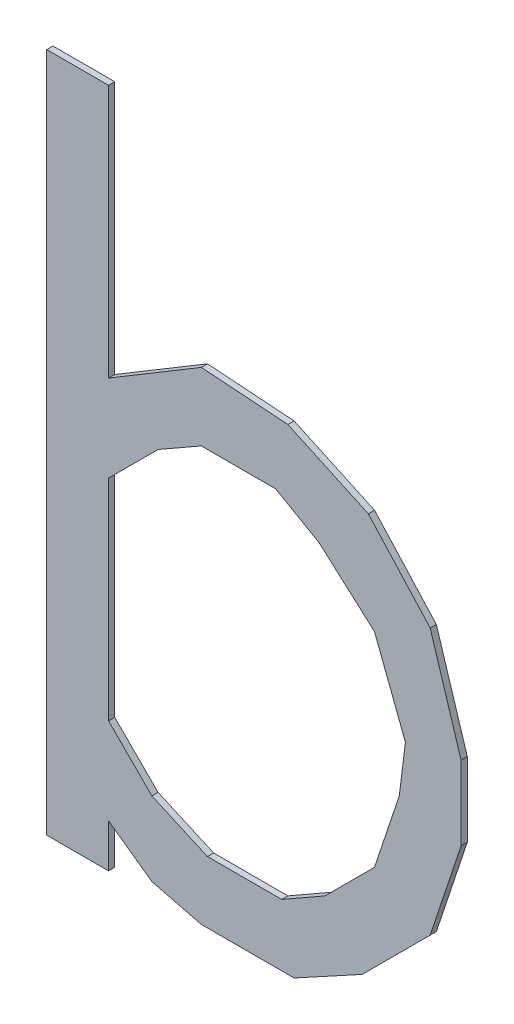
ISO-10303-21;
HEADER;
FILE_DESCRIPTION(('STEP AP214'),'2;1');
FILE_NAME('part.step','',(''),(''),'','','');
FILE_SCHEMA(('AUTOMOTIVE_DESIGN { 1 0 10303 214 1 1 1 1 }'));
ENDSEC;
DATA;
#1=APPLICATION_CONTEXT('core data for automotive mechanical design processes');
#2=APPLICATION_PROTOCOL_DEFINITION('international standard','automotive_design',2000,#1);
#3=PRODUCT_CONTEXT('',#1,'mechanical');
#4=PRODUCT('Part','Part','',(#3));
#5=PRODUCT_RELATED_PRODUCT_CATEGORY('part','',(#4));
#6=PRODUCT_DEFINITION_FORMATION('','',#4);
#7=PRODUCT_DEFINITION_CONTEXT('part definition',#1,'design');
#8=PRODUCT_DEFINITION('design','',#6,#7);
#9=PRODUCT_DEFINITION_SHAPE('','',#8);
#10=(LENGTH_UNIT() NAMED_UNIT(*) SI_UNIT(.MILLI.,.METRE.));
#11=(NAMED_UNIT(*) PLANE_ANGLE_UNIT() SI_UNIT($,.RADIAN.));
#12=(NAMED_UNIT(*) SI_UNIT($,.STERADIAN.) SOLID_ANGLE_UNIT());
#13=UNCERTAINTY_MEASURE_WITH_UNIT(LENGTH_MEASURE(1.E-05),#10,'distance_accuracy_value','');
#14=(GEOMETRIC_REPRESENTATION_CONTEXT(3) GLOBAL_UNCERTAINTY_ASSIGNED_CONTEXT((#13)) GLOBAL_UNIT_ASSIGNED_CONTEXT((#10,
#11,#12)) REPRESENTATION_CONTEXT('',''));
#15=CARTESIAN_POINT('',(0.,0.,0.));
#16=DIRECTION('',(0.,0.,1.));
#17=DIRECTION('',(1.,0.,0.));
#18=AXIS2_PLACEMENT_3D('',#15,#16,#17);
#19=CARTESIAN_POINT('',(-0.2350008,0.14000226,0.));
#20=DIRECTION('',(1.,0.,0.));
#21=DIRECTION('',(0.,0.,-1.));
#22=AXIS2_PLACEMENT_3D('',#19,#20,#21);
#23=PLANE('',#22);
#24=DIRECTION('',(0.,0.,1.));
#25=VECTOR('',#24,1.);
#26=CARTESIAN_POINT('',(-0.2350008,2.539999996998E-06,0.));
#27=LINE('',#26,#25);
#28=CARTESIAN_POINT('',(-0.2350008,2.53999999694202E-06,0.));
#29=VERTEX_POINT('',#28);
#30=CARTESIAN_POINT('',(-0.2350008,2.53999999696469E-06,0.01));
#31=VERTEX_POINT('',#30);
#32=EDGE_CURVE('E257',#29,#31,#27,.T.);
#33=ORIENTED_EDGE('',*,*,#32,.T.);
#34=DIRECTION('',(0.,1.,0.));
#35=VECTOR('',#34,1.);
#36=CARTESIAN_POINT('',(-0.2350008,-0.33999678,0.01));
#37=LINE('',#36,#35);
#38=CARTESIAN_POINT('',(-0.2350008,0.14000225999993,0.01));
#39=VERTEX_POINT('',#38);
#40=EDGE_CURVE('E234',#31,#39,#37,.T.);
#41=ORIENTED_EDGE('',*,*,#40,.T.);
#42=DIRECTION('',(0.,0.,1.));
#43=VECTOR('',#42,1.);
#44=CARTESIAN_POINT('',(-0.235000799999938,0.140002259999897,0.));
#45=LINE('',#44,#43);
#46=CARTESIAN_POINT('',(-0.235000799999985,0.140002259999949,0.));
#47=VERTEX_POINT('',#46);
#48=EDGE_CURVE('E239',#39,#47,#45,.F.);
#49=ORIENTED_EDGE('',*,*,#48,.T.);
#50=DIRECTION('',(0.,1.,0.));
#51=VECTOR('',#50,1.);
#52=CARTESIAN_POINT('',(-0.2350008,-0.33999678,0.));
#53=LINE('',#52,#51);
#54=EDGE_CURVE('E240',#47,#29,#53,.F.);
#55=ORIENTED_EDGE('',*,*,#54,.T.);
#56=EDGE_LOOP('',(#33,#41,#49,#55));
#57=FACE_BOUND('',#56,.T.);
#58=ADVANCED_FACE('F17',(#57),#23,.F.);
#59=CARTESIAN_POINT('',(-0.3350006,0.55000144,0.));
#60=DIRECTION('',(0.,0.,-1.));
#61=DIRECTION('',(-1.,0.,0.));
#62=AXIS2_PLACEMENT_3D('',#59,#60,#61);
#63=PLANE('',#62);
#64=DIRECTION('',(0.,1.,0.));
#65=VECTOR('',#64,1.);
#66=CARTESIAN_POINT('',(-0.3350006,0.55000144,0.));
#67=LINE('',#66,#65);
#68=CARTESIAN_POINT('',(-0.3350006,-0.5499989,0.));
#69=VERTEX_POINT('',#68);
#70=CARTESIAN_POINT('',(-0.3350006,0.55000144,0.));
#71=VERTEX_POINT('',#70);
#72=EDGE_CURVE('E381',#69,#71,#67,.T.);
#73=ORIENTED_EDGE('',*,*,#72,.T.);
#74=DIRECTION('',(-1.,0.,0.));
#75=VECTOR('',#74,1.);
#76=CARTESIAN_POINT('',(-0.3350006,0.55000144,0.));
#77=LINE('',#76,#75);
#78=CARTESIAN_POINT('',(-0.2350008,0.55000144,0.));
#79=VERTEX_POINT('',#78);
#80=EDGE_CURVE('E378',#71,#79,#77,.F.);
#81=ORIENTED_EDGE('',*,*,#80,.T.);
#82=DIRECTION('',(0.,1.,0.));
#83=VECTOR('',#82,1.);
#84=CARTESIAN_POINT('',(-0.2350008,0.55000144,0.));
#85=LINE('',#84,#83);
#86=EDGE_CURVE('E246',#79,#47,#85,.F.);
#87=ORIENTED_EDGE('',*,*,#86,.T.);
#88=DIRECTION('',(0.857492925712544,0.514495755427526,0.));
#89=VECTOR('',#88,1.);
#90=CARTESIAN_POINT('',(-0.2350008,0.14000226,0.));
#91=LINE('',#90,#89);
#92=CARTESIAN_POINT('',(-0.0850010999999992,0.230002080000002,0.));
#93=VERTEX_POINT('',#92);
#94=EDGE_CURVE('E243',#47,#93,#91,.T.);
#95=ORIENTED_EDGE('',*,*,#94,.T.);
#96=DIRECTION('',(0.99745879169011,-0.0712457639449961,0.));
#97=VECTOR('',#96,1.);
#98=CARTESIAN_POINT('',(-0.0850011,0.23000208,0.));
#99=LINE('',#98,#97);
#100=CARTESIAN_POINT('',(0.0550011600000024,0.220002100000014,0.));
#101=VERTEX_POINT('',#100);
#102=EDGE_CURVE('E420',#93,#101,#99,.T.);
#103=ORIENTED_EDGE('',*,*,#102,.T.);
#104=DIRECTION('',(0.907959384500464,-0.41905817746172,0.));
#105=VECTOR('',#104,1.);
#106=CARTESIAN_POINT('',(0.05500115999999,0.2200021,0.));
#107=LINE('',#106,#105);
#108=CARTESIAN_POINT('',(0.185000900000009,0.160002220000004,0.));
#109=VERTEX_POINT('',#108);
#110=EDGE_CURVE('E418',#101,#109,#107,.T.);
#111=ORIENTED_EDGE('',*,*,#110,.T.);
#112=DIRECTION('',(0.672672793996279,-0.739940073395974,0.));
#113=VECTOR('',#112,1.);
#114=CARTESIAN_POINT('',(0.1850009,0.16000222,0.));
#115=LINE('',#114,#113);
#116=CARTESIAN_POINT('',(0.285000699999998,0.0500024399999901,0.));
#117=VERTEX_POINT('',#116);
#118=EDGE_CURVE('E415',#109,#117,#115,.T.);
#119=ORIENTED_EDGE('',*,*,#118,.T.);
#120=DIRECTION('',(0.298274993135964,-0.954479978035025,0.));
#121=VECTOR('',#120,1.);
#122=CARTESIAN_POINT('',(0.2850007,0.0500024399999901,0.));
#123=LINE('',#122,#121);
#124=CARTESIAN_POINT('',(0.3350006,-0.10999724,0.));
#125=VERTEX_POINT('',#124);
#126=EDGE_CURVE('E412',#117,#125,#123,.T.);
#127=ORIENTED_EDGE('',*,*,#126,.T.);
#128=DIRECTION('',(0.,1.,0.));
#129=VECTOR('',#128,1.);
#130=CARTESIAN_POINT('',(0.3350006,0.55000144,0.));
#131=LINE('',#130,#129);
#132=CARTESIAN_POINT('',(0.3350006,-0.229996999999999,0.));
#133=VERTEX_POINT('',#132);
#134=EDGE_CURVE('E409',#125,#133,#131,.F.);
#135=ORIENTED_EDGE('',*,*,#134,.T.);
#136=DIRECTION('',(-0.316227766016838,-0.948683298050514,0.));
#137=VECTOR('',#136,1.);
#138=CARTESIAN_POINT('',(0.3350006,-0.229997,0.));
#139=LINE('',#138,#137);
#140=CARTESIAN_POINT('',(0.285000699999993,-0.379996699999986,0.));
#141=VERTEX_POINT('',#140);
#142=EDGE_CURVE('E406',#133,#141,#139,.T.);
#143=ORIENTED_EDGE('',*,*,#142,.T.);
#144=DIRECTION('',(-0.707098617348147,-0.707114944930694,0.));
#145=VECTOR('',#144,1.);
#146=CARTESIAN_POINT('',(0.2850007,-0.3799967,0.));
#147=LINE('',#146,#145);
#148=CARTESIAN_POINT('',(0.175000919999995,-0.48999901999998,0.));
#149=VERTEX_POINT('',#148);
#150=EDGE_CURVE('E403',#141,#149,#147,.T.);
#151=ORIENTED_EDGE('',*,*,#150,.T.);
#152=DIRECTION('',(-0.877895572914404,-0.478852130680538,0.));
#153=VECTOR('',#152,1.);
#154=CARTESIAN_POINT('',(0.17500092,-0.48999902,0.));
#155=LINE('',#154,#153);
#156=CARTESIAN_POINT('',(0.06500113999999,-0.5499989,0.));
#157=VERTEX_POINT('',#156);
#158=EDGE_CURVE('E400',#149,#157,#155,.T.);
#159=ORIENTED_EDGE('',*,*,#158,.T.);
#160=DIRECTION('',(-1.,0.,0.));
#161=VECTOR('',#160,1.);
#162=CARTESIAN_POINT('',(-0.3350006,-0.5499989,0.));
#163=LINE('',#162,#161);
#164=CARTESIAN_POINT('',(-0.0850010999999976,-0.549998899999995,0.));
#165=VERTEX_POINT('',#164);
#166=EDGE_CURVE('E397',#157,#165,#163,.T.);
#167=ORIENTED_EDGE('',*,*,#166,.T.);
#168=DIRECTION('',(-0.970142500145333,0.24253562503633,0.));
#169=VECTOR('',#168,1.);
#170=CARTESIAN_POINT('',(-0.0850011,-0.5499989,0.));
#171=LINE('',#170,#169);
#172=CARTESIAN_POINT('',(-0.165000939999995,-0.529998939999996,0.));
#173=VERTEX_POINT('',#172);
#174=EDGE_CURVE('E394',#165,#173,#171,.T.);
#175=ORIENTED_EDGE('',*,*,#174,.T.);
#176=DIRECTION('',(-0.813733471206734,0.581238193719097,0.));
#177=VECTOR('',#176,1.);
#178=CARTESIAN_POINT('',(-0.16500094,-0.52999894,0.));
#179=LINE('',#178,#177);
#180=CARTESIAN_POINT('',(-0.2350008,-0.47999904,0.));
#181=VERTEX_POINT('',#180);
#182=EDGE_CURVE('E391',#173,#181,#179,.T.);
#183=ORIENTED_EDGE('',*,*,#182,.T.);
#184=DIRECTION('',(0.,1.,0.));
#185=VECTOR('',#184,1.);
#186=CARTESIAN_POINT('',(-0.2350008,0.55000144,0.));
#187=LINE('',#186,#185);
#188=CARTESIAN_POINT('',(-0.2350008,-0.5499989,0.));
#189=VERTEX_POINT('',#188);
#190=EDGE_CURVE('E388',#181,#189,#187,.F.);
#191=ORIENTED_EDGE('',*,*,#190,.T.);
#192=DIRECTION('',(-1.,0.,0.));
#193=VECTOR('',#192,1.);
#194=CARTESIAN_POINT('',(-0.3350006,-0.5499989,0.));
#195=LINE('',#194,#193);
#196=EDGE_CURVE('E385',#189,#69,#195,.T.);
#197=ORIENTED_EDGE('',*,*,#196,.T.);
#198=EDGE_LOOP('',(#73,#81,#87,#95,#103,#111,#119,#127,#135,#143,#151,#159,#167,#175,#183,#191,#197));
#199=FACE_BOUND('',#198,.T.);
#200=DIRECTION('',(-0.868243142124459,-0.496138938356834,0.));
#201=VECTOR('',#200,1.);
#202=CARTESIAN_POINT('',(-0.0850011,0.1200023,0.));
#203=LINE('',#202,#201);
#204=CARTESIAN_POINT('',(-0.0850010999999975,0.120002299999998,0.));
#205=VERTEX_POINT('',#204);
#206=CARTESIAN_POINT('',(-0.155000959999999,0.0800023799999998,0.));
#207=VERTEX_POINT('',#206);
#208=EDGE_CURVE('E255',#205,#207,#203,.T.);
#209=ORIENTED_EDGE('',*,*,#208,.T.);
#210=DIRECTION('',(-0.707106781186534,-0.707106781186561,0.));
#211=VECTOR('',#210,1.);
#212=CARTESIAN_POINT('',(-0.15500096,0.08000238,0.));
#213=LINE('',#212,#211);
#214=EDGE_CURVE('E235',#207,#29,#213,.T.);
#215=ORIENTED_EDGE('',*,*,#214,.T.);
#216=DIRECTION('',(0.,1.,0.));
#217=VECTOR('',#216,1.);
#218=CARTESIAN_POINT('',(-0.2350008,0.55000144,0.));
#219=LINE('',#218,#217);
#220=CARTESIAN_POINT('',(-0.2350008,-0.33999678,0.));
#221=VERTEX_POINT('',#220);
#222=EDGE_CURVE('E230',#29,#221,#219,.F.);
#223=ORIENTED_EDGE('',*,*,#222,.T.);
#224=DIRECTION('',(0.707106781186547,-0.707106781186548,0.));
#225=VECTOR('',#224,1.);
#226=CARTESIAN_POINT('',(-0.2350008,-0.33999678,0.));
#227=LINE('',#226,#225);
#228=CARTESIAN_POINT('',(-0.165000940000001,-0.409996640000009,0.));
#229=VERTEX_POINT('',#228);
#230=EDGE_CURVE('E20',#221,#229,#227,.T.);
#231=ORIENTED_EDGE('',*,*,#230,.T.);
#232=DIRECTION('',(0.913811548620257,-0.406138466053447,0.));
#233=VECTOR('',#232,1.);
#234=CARTESIAN_POINT('',(-0.16500094,-0.40999664,0.));
#235=LINE('',#234,#233);
#236=CARTESIAN_POINT('',(-0.07500112,-0.44999656,0.));
#237=VERTEX_POINT('',#236);
#238=EDGE_CURVE('E285',#229,#237,#235,.T.);
#239=ORIENTED_EDGE('',*,*,#238,.T.);
#240=DIRECTION('',(-1.,0.,0.));
#241=VECTOR('',#240,1.);
#242=CARTESIAN_POINT('',(-0.3350006,-0.44999656,0.));
#243=LINE('',#242,#241);
#244=CARTESIAN_POINT('',(0.0450011800000162,-0.449996560000005,0.));
#245=VERTEX_POINT('',#244);
#246=EDGE_CURVE('E283',#237,#245,#243,.F.);
#247=ORIENTED_EDGE('',*,*,#246,.T.);
#248=DIRECTION('',(0.868243142124429,0.496138938356887,0.));
#249=VECTOR('',#248,1.);
#250=CARTESIAN_POINT('',(0.04500118000001,-0.44999656,0.));
#251=LINE('',#250,#249);
#252=CARTESIAN_POINT('',(0.11500104,-0.40999664,0.));
#253=VERTEX_POINT('',#252);
#254=EDGE_CURVE('E280',#245,#253,#251,.T.);
#255=ORIENTED_EDGE('',*,*,#254,.T.);
#256=DIRECTION('',(0.707106781186547,0.707106781186548,0.));
#257=VECTOR('',#256,1.);
#258=CARTESIAN_POINT('',(0.11500104,-0.40999664,0.));
#259=LINE('',#258,#257);
#260=CARTESIAN_POINT('',(0.19500088,-0.3299968,0.));
#261=VERTEX_POINT('',#260);
#262=EDGE_CURVE('E277',#253,#261,#259,.T.);
#263=ORIENTED_EDGE('',*,*,#262,.T.);
#264=DIRECTION('',(0.316227766016838,0.948683298050514,0.));
#265=VECTOR('',#264,1.);
#266=CARTESIAN_POINT('',(0.19500088,-0.3299968,0.));
#267=LINE('',#266,#265);
#268=CARTESIAN_POINT('',(0.235000800000005,-0.20999704,0.));
#269=VERTEX_POINT('',#268);
#270=EDGE_CURVE('E274',#261,#269,#267,.T.);
#271=ORIENTED_EDGE('',*,*,#270,.T.);
#272=DIRECTION('',(0.124034734589208,0.992277876713668,0.));
#273=VECTOR('',#272,1.);
#274=CARTESIAN_POINT('',(0.2350008,-0.20999704,0.));
#275=LINE('',#274,#273);
#276=CARTESIAN_POINT('',(0.245000780000005,-0.129997199999996,0.));
#277=VERTEX_POINT('',#276);
#278=EDGE_CURVE('E271',#269,#277,#275,.T.);
#279=ORIENTED_EDGE('',*,*,#278,.T.);
#280=DIRECTION('',(-0.358979079308876,0.933345606203057,0.));
#281=VECTOR('',#280,1.);
#282=CARTESIAN_POINT('',(0.24500078,-0.1299972,0.));
#283=LINE('',#282,#281);
#284=CARTESIAN_POINT('',(0.195000880000003,2.54000000350266E-06,0.));
#285=VERTEX_POINT('',#284);
#286=EDGE_CURVE('E268',#277,#285,#283,.T.);
#287=ORIENTED_EDGE('',*,*,#286,.T.);
#288=DIRECTION('',(-0.747409318683647,0.664363838829934,0.));
#289=VECTOR('',#288,1.);
#290=CARTESIAN_POINT('',(0.19500088,2.5399999970064E-06,0.));
#291=LINE('',#290,#289);
#292=CARTESIAN_POINT('',(0.105001060000001,0.0800023800000038,0.));
#293=VERTEX_POINT('',#292);
#294=EDGE_CURVE('E265',#285,#293,#291,.T.);
#295=ORIENTED_EDGE('',*,*,#294,.T.);
#296=DIRECTION('',(-0.868243142124429,0.496138938356887,0.));
#297=VECTOR('',#296,1.);
#298=CARTESIAN_POINT('',(0.10500106,0.08000238,0.));
#299=LINE('',#298,#297);
#300=CARTESIAN_POINT('',(0.0350012000000099,0.1200023,0.));
#301=VERTEX_POINT('',#300);
#302=EDGE_CURVE('E262',#293,#301,#299,.T.);
#303=ORIENTED_EDGE('',*,*,#302,.T.);
#304=DIRECTION('',(-1.,0.,0.));
#305=VECTOR('',#304,1.);
#306=CARTESIAN_POINT('',(-0.3350006,0.1200023,0.));
#307=LINE('',#306,#305);
#308=EDGE_CURVE('E259',#301,#205,#307,.T.);
#309=ORIENTED_EDGE('',*,*,#308,.T.);
#310=EDGE_LOOP('',(#209,#215,#223,#231,#239,#247,#255,#263,#271,#279,#287,#295,#303,#309));
#311=FACE_BOUND('',#310,.T.);
#312=ADVANCED_FACE('F237',(#199,#311),#63,.T.);
#313=CARTESIAN_POINT('',(-0.16500094,-0.40999664,0.));
#314=DIRECTION('',(-0.707106781186548,-0.707106781186548,0.));
#315=DIRECTION('',(0.707106781186548,-0.707106781186548,0.));
#316=AXIS2_PLACEMENT_3D('',#313,#314,#315);
#317=PLANE('',#316);
#318=DIRECTION('',(0.,0.,1.));
#319=VECTOR('',#318,1.);
#320=CARTESIAN_POINT('',(-0.2350008,-0.33999678,0.));
#321=LINE('',#320,#319);
#322=CARTESIAN_POINT('',(-0.2350008,-0.33999678,0.01));
#323=VERTEX_POINT('',#322);
#324=EDGE_CURVE('E220',#221,#323,#321,.T.);
#325=ORIENTED_EDGE('',*,*,#324,.T.);
#326=DIRECTION('',(0.707106781186548,-0.707106781186548,0.));
#327=VECTOR('',#326,1.);
#328=CARTESIAN_POINT('',(-0.16500094,-0.40999664,0.01));
#329=LINE('',#328,#327);
#330=CARTESIAN_POINT('',(-0.165000939999977,-0.409996640000043,0.01));
#331=VERTEX_POINT('',#330);
#332=EDGE_CURVE('E375',#323,#331,#329,.T.);
#333=ORIENTED_EDGE('',*,*,#332,.T.);
#334=DIRECTION('',(0.,0.,1.));
#335=VECTOR('',#334,1.);
#336=CARTESIAN_POINT('',(-0.165000940000012,-0.409996640000027,0.));
#337=LINE('',#336,#335);
#338=EDGE_CURVE('E222',#331,#229,#337,.F.);
#339=ORIENTED_EDGE('',*,*,#338,.T.);
#340=ORIENTED_EDGE('',*,*,#230,.F.);
#341=EDGE_LOOP('',(#325,#333,#339,#340));
#342=FACE_BOUND('',#341,.T.);
#343=ADVANCED_FACE('F218',(#342),#317,.F.);
#344=CARTESIAN_POINT('',(-0.07500112,-0.44999656,0.));
#345=DIRECTION('',(-0.406138466053169,-0.913811548620381,0.));
#346=DIRECTION('',(0.913811548620381,-0.406138466053169,0.));
#347=AXIS2_PLACEMENT_3D('',#344,#345,#346);
#348=PLANE('',#347);
#349=ORIENTED_EDGE('',*,*,#338,.F.);
#350=DIRECTION('',(0.913811548620381,-0.406138466053169,0.));
#351=VECTOR('',#350,1.);
#352=CARTESIAN_POINT('',(-0.07500112,-0.44999656,0.01));
#353=LINE('',#352,#351);
#354=CARTESIAN_POINT('',(-0.07500112,-0.44999656,0.01));
#355=VERTEX_POINT('',#354);
#356=EDGE_CURVE('E372',#331,#355,#353,.T.);
#357=ORIENTED_EDGE('',*,*,#356,.T.);
#358=DIRECTION('',(0.,0.,-1.));
#359=VECTOR('',#358,1.);
#360=CARTESIAN_POINT('',(-0.07500112,-0.44999656,0.));
#361=LINE('',#360,#359);
#362=EDGE_CURVE('E284',#355,#237,#361,.T.);
#363=ORIENTED_EDGE('',*,*,#362,.T.);
#364=ORIENTED_EDGE('',*,*,#238,.F.);
#365=EDGE_LOOP('',(#349,#357,#363,#364));
#366=FACE_BOUND('',#365,.T.);
#367=ADVANCED_FACE('F765',(#366),#348,.F.);
#368=CARTESIAN_POINT('',(0.04500118000001,-0.44999656,0.));
#369=DIRECTION('',(0.,-1.,0.));
#370=DIRECTION('',(0.,0.,-1.));
#371=AXIS2_PLACEMENT_3D('',#368,#369,#370);
#372=PLANE('',#371);
#373=ORIENTED_EDGE('',*,*,#362,.F.);
#374=DIRECTION('',(1.,0.,0.));
#375=VECTOR('',#374,1.);
#376=CARTESIAN_POINT('',(0.04500118000001,-0.44999656,0.01));
#377=LINE('',#376,#375);
#378=CARTESIAN_POINT('',(0.0450011800000414,-0.449996560000011,0.01));
#379=VERTEX_POINT('',#378);
#380=EDGE_CURVE('E369',#355,#379,#377,.T.);
#381=ORIENTED_EDGE('',*,*,#380,.T.);
#382=DIRECTION('',(0.,0.,1.));
#383=VECTOR('',#382,1.);
#384=CARTESIAN_POINT('',(0.0450011800000224,-0.449996560000022,0.));
#385=LINE('',#384,#383);
#386=EDGE_CURVE('E282',#379,#245,#385,.F.);
#387=ORIENTED_EDGE('',*,*,#386,.T.);
#388=ORIENTED_EDGE('',*,*,#246,.F.);
#389=EDGE_LOOP('',(#373,#381,#387,#388));
#390=FACE_BOUND('',#389,.T.);
#391=ADVANCED_FACE('F456',(#390),#372,.F.);
#392=CARTESIAN_POINT('',(0.11500104,-0.40999664,0.));
#393=DIRECTION('',(0.496138938357157,-0.868243142124275,0.));
#394=DIRECTION('',(0.868243142124275,0.496138938357157,0.));
#395=AXIS2_PLACEMENT_3D('',#392,#393,#394);
#396=PLANE('',#395);
#397=ORIENTED_EDGE('',*,*,#386,.F.);
#398=DIRECTION('',(0.868243142124275,0.496138938357157,0.));
#399=VECTOR('',#398,1.);
#400=CARTESIAN_POINT('',(0.11500104,-0.40999664,0.01));
#401=LINE('',#400,#399);
#402=CARTESIAN_POINT('',(0.11500104,-0.40999664,0.01));
#403=VERTEX_POINT('',#402);
#404=EDGE_CURVE('E366',#379,#403,#401,.T.);
#405=ORIENTED_EDGE('',*,*,#404,.T.);
#406=DIRECTION('',(0.,0.,1.));
#407=VECTOR('',#406,1.);
#408=CARTESIAN_POINT('',(0.11500104,-0.40999664,0.));
#409=LINE('',#408,#407);
#410=EDGE_CURVE('E279',#403,#253,#409,.F.);
#411=ORIENTED_EDGE('',*,*,#410,.T.);
#412=ORIENTED_EDGE('',*,*,#254,.F.);
#413=EDGE_LOOP('',(#397,#405,#411,#412));
#414=FACE_BOUND('',#413,.T.);
#415=ADVANCED_FACE('F461',(#414),#396,.F.);
#416=CARTESIAN_POINT('',(0.19500088,-0.3299968,0.));
#417=DIRECTION('',(0.707106781186548,-0.707106781186548,0.));
#418=DIRECTION('',(0.707106781186548,0.707106781186548,0.));
#419=AXIS2_PLACEMENT_3D('',#416,#417,#418);
#420=PLANE('',#419);
#421=ORIENTED_EDGE('',*,*,#410,.F.);
#422=DIRECTION('',(0.707106781186548,0.707106781186548,0.));
#423=VECTOR('',#422,1.);
#424=CARTESIAN_POINT('',(0.19500088,-0.3299968,0.01));
#425=LINE('',#424,#423);
#426=CARTESIAN_POINT('',(0.19500088,-0.3299968,0.01));
#427=VERTEX_POINT('',#426);
#428=EDGE_CURVE('E363',#403,#427,#425,.T.);
#429=ORIENTED_EDGE('',*,*,#428,.T.);
#430=DIRECTION('',(0.,0.,1.));
#431=VECTOR('',#430,1.);
#432=CARTESIAN_POINT('',(0.19500088,-0.3299968,0.));
#433=LINE('',#432,#431);
#434=EDGE_CURVE('E276',#427,#261,#433,.F.);
#435=ORIENTED_EDGE('',*,*,#434,.T.);
#436=ORIENTED_EDGE('',*,*,#262,.F.);
#437=EDGE_LOOP('',(#421,#429,#435,#436));
#438=FACE_BOUND('',#437,.T.);
#439=ADVANCED_FACE('F470',(#438),#420,.F.);
#440=CARTESIAN_POINT('',(0.2350008,-0.20999704,0.));
#441=DIRECTION('',(0.948683298050514,-0.316227766016838,0.));
#442=DIRECTION('',(0.316227766016838,0.948683298050514,0.));
#443=AXIS2_PLACEMENT_3D('',#440,#441,#442);
#444=PLANE('',#443);
#445=ORIENTED_EDGE('',*,*,#434,.F.);
#446=DIRECTION('',(0.316227766016838,0.948683298050514,0.));
#447=VECTOR('',#446,1.);
#448=CARTESIAN_POINT('',(0.2350008,-0.20999704,0.01));
#449=LINE('',#448,#447);
#450=CARTESIAN_POINT('',(0.235000800000026,-0.209997039999953,0.01));
#451=VERTEX_POINT('',#450);
#452=EDGE_CURVE('E360',#427,#451,#449,.T.);
#453=ORIENTED_EDGE('',*,*,#452,.T.);
#454=DIRECTION('',(0.,0.,1.));
#455=VECTOR('',#454,1.);
#456=CARTESIAN_POINT('',(0.23500080000002,-0.209997040000003,0.));
#457=LINE('',#456,#455);
#458=EDGE_CURVE('E273',#451,#269,#457,.F.);
#459=ORIENTED_EDGE('',*,*,#458,.T.);
#460=ORIENTED_EDGE('',*,*,#270,.F.);
#461=EDGE_LOOP('',(#445,#453,#459,#460));
#462=FACE_BOUND('',#461,.T.);
#463=ADVANCED_FACE('F475',(#462),#444,.F.);
#464=CARTESIAN_POINT('',(0.24500078,-0.1299972,0.));
#465=DIRECTION('',(0.992277876713698,-0.124034734588962,0.));
#466=DIRECTION('',(0.124034734588962,0.992277876713698,0.));
#467=AXIS2_PLACEMENT_3D('',#464,#465,#466);
#468=PLANE('',#467);
#469=ORIENTED_EDGE('',*,*,#458,.F.);
#470=DIRECTION('',(0.124034734588962,0.992277876713698,0.));
#471=VECTOR('',#470,1.);
#472=CARTESIAN_POINT('',(0.24500078,-0.1299972,0.01));
#473=LINE('',#472,#471);
#474=CARTESIAN_POINT('',(0.245000780000011,-0.129997199999977,0.01));
#475=VERTEX_POINT('',#474);
#476=EDGE_CURVE('E357',#451,#475,#473,.T.);
#477=ORIENTED_EDGE('',*,*,#476,.T.);
#478=DIRECTION('',(0.,0.,1.));
#479=VECTOR('',#478,1.);
#480=CARTESIAN_POINT('',(0.245000780000018,-0.129997199999993,0.));
#481=LINE('',#480,#479);
#482=EDGE_CURVE('E270',#475,#277,#481,.F.);
#483=ORIENTED_EDGE('',*,*,#482,.T.);
#484=ORIENTED_EDGE('',*,*,#278,.F.);
#485=EDGE_LOOP('',(#469,#477,#483,#484));
#486=FACE_BOUND('',#485,.T.);
#487=ADVANCED_FACE('F477',(#486),#468,.F.);
#488=CARTESIAN_POINT('',(0.19500088,2.539999996998E-06,0.));
#489=DIRECTION('',(0.933345606203008,0.358979079309003,0.));
#490=DIRECTION('',(-0.358979079309003,0.933345606203008,0.));
#491=AXIS2_PLACEMENT_3D('',#488,#489,#490);
#492=PLANE('',#491);
#493=ORIENTED_EDGE('',*,*,#482,.F.);
#494=DIRECTION('',(-0.358979079309003,0.933345606203008,0.));
#495=VECTOR('',#494,1.);
#496=CARTESIAN_POINT('',(0.19500088,2.539999996998E-06,0.01));
#497=LINE('',#496,#495);
#498=CARTESIAN_POINT('',(0.195000879999999,2.54000002790737E-06,0.01));
#499=VERTEX_POINT('',#498);
#500=EDGE_CURVE('E354',#475,#499,#497,.T.);
#501=ORIENTED_EDGE('',*,*,#500,.T.);
#502=DIRECTION('',(0.,0.,1.));
#503=VECTOR('',#502,1.);
#504=CARTESIAN_POINT('',(0.195000880000015,2.54000001360824E-06,0.));
#505=LINE('',#504,#503);
#506=EDGE_CURVE('E267',#499,#285,#505,.F.);
#507=ORIENTED_EDGE('',*,*,#506,.T.);
#508=ORIENTED_EDGE('',*,*,#286,.F.);
#509=EDGE_LOOP('',(#493,#501,#507,#508));
#510=FACE_BOUND('',#509,.T.);
#511=ADVANCED_FACE('F482',(#510),#492,.F.);
#512=CARTESIAN_POINT('',(0.10500106,0.08000238,0.));
#513=DIRECTION('',(0.664363838829796,0.74740931868377,0.));
#514=DIRECTION('',(-0.74740931868377,0.664363838829796,0.));
#515=AXIS2_PLACEMENT_3D('',#512,#513,#514);
#516=PLANE('',#515);
#517=ORIENTED_EDGE('',*,*,#506,.F.);
#518=DIRECTION('',(-0.74740931868377,0.664363838829796,0.));
#519=VECTOR('',#518,1.);
#520=CARTESIAN_POINT('',(0.10500106,0.08000238,0.01));
#521=LINE('',#520,#519);
#522=CARTESIAN_POINT('',(0.105001059999976,0.0800023800000307,0.01));
#523=VERTEX_POINT('',#522);
#524=EDGE_CURVE('E351',#499,#523,#521,.T.);
#525=ORIENTED_EDGE('',*,*,#524,.T.);
#526=DIRECTION('',(0.,0.,1.));
#527=VECTOR('',#526,1.);
#528=CARTESIAN_POINT('',(0.105001060000007,0.080002380000013,0.));
#529=LINE('',#528,#527);
#530=EDGE_CURVE('E264',#523,#293,#529,.F.);
#531=ORIENTED_EDGE('',*,*,#530,.T.);
#532=ORIENTED_EDGE('',*,*,#294,.F.);
#533=EDGE_LOOP('',(#517,#525,#531,#532));
#534=FACE_BOUND('',#533,.T.);
#535=ADVANCED_FACE('F487',(#534),#516,.F.);
#536=CARTESIAN_POINT('',(0.03500120000001,0.1200023,0.));
#537=DIRECTION('',(0.496138938356726,0.868243142124521,0.));
#538=DIRECTION('',(-0.868243142124521,0.496138938356726,0.));
#539=AXIS2_PLACEMENT_3D('',#536,#537,#538);
#540=PLANE('',#539);
#541=ORIENTED_EDGE('',*,*,#530,.F.);
#542=DIRECTION('',(-0.868243142124521,0.496138938356726,0.));
#543=VECTOR('',#542,1.);
#544=CARTESIAN_POINT('',(0.03500120000001,0.1200023,0.01));
#545=LINE('',#544,#543);
#546=CARTESIAN_POINT('',(0.0350012000000099,0.1200023,0.01));
#547=VERTEX_POINT('',#546);
#548=EDGE_CURVE('E348',#523,#547,#545,.T.);
#549=ORIENTED_EDGE('',*,*,#548,.T.);
#550=DIRECTION('',(0.,0.,1.));
#551=VECTOR('',#550,1.);
#552=CARTESIAN_POINT('',(0.03500120000001,0.1200023,0.));
#553=LINE('',#552,#551);
#554=EDGE_CURVE('E261',#547,#301,#553,.F.);
#555=ORIENTED_EDGE('',*,*,#554,.T.);
#556=ORIENTED_EDGE('',*,*,#302,.F.);
#557=EDGE_LOOP('',(#541,#549,#555,#556));
#558=FACE_BOUND('',#557,.T.);
#559=ADVANCED_FACE('F489',(#558),#540,.F.);
#560=CARTESIAN_POINT('',(-0.0850011,0.1200023,0.));
#561=DIRECTION('',(0.,1.,0.));
#562=DIRECTION('',(0.,0.,1.));
#563=AXIS2_PLACEMENT_3D('',#560,#561,#562);
#564=PLANE('',#563);
#565=ORIENTED_EDGE('',*,*,#554,.F.);
#566=DIRECTION('',(1.,0.,0.));
#567=VECTOR('',#566,1.);
#568=CARTESIAN_POINT('',(-0.0850011,0.1200023,0.01));
#569=LINE('',#568,#567);
#570=CARTESIAN_POINT('',(-0.0850010999999874,0.120002299999996,0.01));
#571=VERTEX_POINT('',#570);
#572=EDGE_CURVE('E345',#547,#571,#569,.F.);
#573=ORIENTED_EDGE('',*,*,#572,.T.);
#574=DIRECTION('',(0.,0.,1.));
#575=VECTOR('',#574,1.);
#576=CARTESIAN_POINT('',(-0.085001099999995,0.120002299999991,0.));
#577=LINE('',#576,#575);
#578=EDGE_CURVE('E258',#571,#205,#577,.F.);
#579=ORIENTED_EDGE('',*,*,#578,.T.);
#580=ORIENTED_EDGE('',*,*,#308,.F.);
#581=EDGE_LOOP('',(#565,#573,#579,#580));
#582=FACE_BOUND('',#581,.T.);
#583=ADVANCED_FACE('F493',(#582),#564,.F.);
#584=CARTESIAN_POINT('',(-0.15500096,0.08000238,0.));
#585=DIRECTION('',(-0.496138938356726,0.868243142124521,0.));
#586=DIRECTION('',(-0.868243142124521,-0.496138938356726,0.));
#587=AXIS2_PLACEMENT_3D('',#584,#585,#586);
#588=PLANE('',#587);
#589=ORIENTED_EDGE('',*,*,#578,.F.);
#590=DIRECTION('',(-0.868243142124521,-0.496138938356726,0.));
#591=VECTOR('',#590,1.);
#592=CARTESIAN_POINT('',(-0.15500096,0.08000238,0.01));
#593=LINE('',#592,#591);
#594=CARTESIAN_POINT('',(-0.155000959999996,0.0800023800000012,0.01));
#595=VERTEX_POINT('',#594);
#596=EDGE_CURVE('E342',#571,#595,#593,.T.);
#597=ORIENTED_EDGE('',*,*,#596,.T.);
#598=DIRECTION('',(0.,0.,1.));
#599=VECTOR('',#598,1.);
#600=CARTESIAN_POINT('',(-0.155000959999998,0.0800023799999985,0.));
#601=LINE('',#600,#599);
#602=EDGE_CURVE('E254',#595,#207,#601,.F.);
#603=ORIENTED_EDGE('',*,*,#602,.T.);
#604=ORIENTED_EDGE('',*,*,#208,.F.);
#605=EDGE_LOOP('',(#589,#597,#603,#604));
#606=FACE_BOUND('',#605,.T.);
#607=ADVANCED_FACE('F497',(#606),#588,.F.);
#608=CARTESIAN_POINT('',(-0.2350008,2.539999996998E-06,0.));
#609=DIRECTION('',(-0.707106781186548,0.707106781186548,0.));
#610=DIRECTION('',(-0.707106781186548,-0.707106781186548,0.));
#611=AXIS2_PLACEMENT_3D('',#608,#609,#610);
#612=PLANE('',#611);
#613=ORIENTED_EDGE('',*,*,#602,.F.);
#614=DIRECTION('',(-0.707106781186548,-0.707106781186548,0.));
#615=VECTOR('',#614,1.);
#616=CARTESIAN_POINT('',(-0.2350008,2.539999996998E-06,0.01));
#617=LINE('',#616,#615);
#618=EDGE_CURVE('E339',#595,#31,#617,.T.);
#619=ORIENTED_EDGE('',*,*,#618,.T.);
#620=ORIENTED_EDGE('',*,*,#32,.F.);
#621=ORIENTED_EDGE('',*,*,#214,.F.);
#622=EDGE_LOOP('',(#613,#619,#620,#621));
#623=FACE_BOUND('',#622,.T.);
#624=ADVANCED_FACE('F499',(#623),#612,.F.);
#625=CARTESIAN_POINT('',(-0.2350008,-0.33999678,0.));
#626=DIRECTION('',(-1.,0.,0.));
#627=DIRECTION('',(0.,0.,1.));
#628=AXIS2_PLACEMENT_3D('',#625,#626,#627);
#629=PLANE('',#628);
#630=ORIENTED_EDGE('',*,*,#54,.F.);
#631=ORIENTED_EDGE('',*,*,#86,.F.);
#632=DIRECTION('',(0.,0.,-1.));
#633=VECTOR('',#632,1.);
#634=CARTESIAN_POINT('',(-0.2350008,0.55000144,0.));
#635=LINE('',#634,#633);
#636=CARTESIAN_POINT('',(-0.2350008,0.55000144,0.01));
#637=VERTEX_POINT('',#636);
#638=EDGE_CURVE('E383',#79,#637,#635,.F.);
#639=ORIENTED_EDGE('',*,*,#638,.T.);
#640=DIRECTION('',(0.,1.,0.));
#641=VECTOR('',#640,1.);
#642=CARTESIAN_POINT('',(-0.2350008,-0.33999678,0.01));
#643=LINE('',#642,#641);
#644=EDGE_CURVE('E336',#637,#39,#643,.F.);
#645=ORIENTED_EDGE('',*,*,#644,.T.);
#646=ORIENTED_EDGE('',*,*,#40,.F.);
#647=DIRECTION('',(0.,1.,0.));
#648=VECTOR('',#647,1.);
#649=CARTESIAN_POINT('',(-0.2350008,-0.33999678,0.01));
#650=LINE('',#649,#648);
#651=EDGE_CURVE('E233',#31,#323,#650,.F.);
#652=ORIENTED_EDGE('',*,*,#651,.T.);
#653=ORIENTED_EDGE('',*,*,#324,.F.);
#654=ORIENTED_EDGE('',*,*,#222,.F.);
#655=EDGE_LOOP('',(#630,#631,#639,#645,#646,#652,#653,#654));
#656=FACE_BOUND('',#655,.T.);
#657=ADVANCED_FACE('F229',(#656),#629,.F.);
#658=CARTESIAN_POINT('',(-0.0850011,0.23000208,0.));
#659=DIRECTION('',(0.514495755428115,-0.857492925712191,0.));
#660=DIRECTION('',(0.857492925712191,0.514495755428115,0.));
#661=AXIS2_PLACEMENT_3D('',#658,#659,#660);
#662=PLANE('',#661);
#663=ORIENTED_EDGE('',*,*,#48,.F.);
#664=DIRECTION('',(0.857492925712191,0.514495755428115,0.));
#665=VECTOR('',#664,1.);
#666=CARTESIAN_POINT('',(-0.0850011,0.23000208,0.01));
#667=LINE('',#666,#665);
#668=CARTESIAN_POINT('',(-0.0850010999999954,0.230002080000006,0.01));
#669=VERTEX_POINT('',#668);
#670=EDGE_CURVE('E333',#39,#669,#667,.T.);
#671=ORIENTED_EDGE('',*,*,#670,.T.);
#672=DIRECTION('',(0.,0.,1.));
#673=VECTOR('',#672,1.);
#674=CARTESIAN_POINT('',(-0.0850010999999996,0.230002080000006,0.));
#675=LINE('',#674,#673);
#676=EDGE_CURVE('E421',#669,#93,#675,.F.);
#677=ORIENTED_EDGE('',*,*,#676,.T.);
#678=ORIENTED_EDGE('',*,*,#94,.F.);
#679=EDGE_LOOP('',(#663,#671,#677,#678));
#680=FACE_BOUND('',#679,.T.);
#681=ADVANCED_FACE('F583',(#680),#662,.F.);
#682=CARTESIAN_POINT('',(0.05500115999999,0.2200021,0.));
#683=DIRECTION('',(-0.0712457639450376,-0.997458791690107,0.));
#684=DIRECTION('',(0.997458791690107,-0.0712457639450376,0.));
#685=AXIS2_PLACEMENT_3D('',#682,#683,#684);
#686=PLANE('',#685);
#687=ORIENTED_EDGE('',*,*,#676,.F.);
#688=DIRECTION('',(0.997458791690107,-0.0712457639450376,0.));
#689=VECTOR('',#688,1.);
#690=CARTESIAN_POINT('',(0.05500115999999,0.2200021,0.01));
#691=LINE('',#690,#689);
#692=CARTESIAN_POINT('',(0.055001160000094,0.220002100000023,0.01));
#693=VERTEX_POINT('',#692);
#694=EDGE_CURVE('E330',#669,#693,#691,.T.);
#695=ORIENTED_EDGE('',*,*,#694,.T.);
#696=DIRECTION('',(0.,0.,1.));
#697=VECTOR('',#696,1.);
#698=CARTESIAN_POINT('',(0.0550011600000169,0.220002100000058,0.));
#699=LINE('',#698,#697);
#700=EDGE_CURVE('E419',#693,#101,#699,.F.);
#701=ORIENTED_EDGE('',*,*,#700,.T.);
#702=ORIENTED_EDGE('',*,*,#102,.F.);
#703=EDGE_LOOP('',(#687,#695,#701,#702));
#704=FACE_BOUND('',#703,.T.);
#705=ADVANCED_FACE('F585',(#704),#686,.F.);
#706=CARTESIAN_POINT('',(0.1850009,0.16000222,0.));
#707=DIRECTION('',(-0.419058177462127,-0.907959384500276,0.));
#708=DIRECTION('',(0.907959384500276,-0.419058177462127,0.));
#709=AXIS2_PLACEMENT_3D('',#706,#707,#708);
#710=PLANE('',#709);
#711=ORIENTED_EDGE('',*,*,#700,.F.);
#712=DIRECTION('',(0.907959384500276,-0.419058177462127,0.));
#713=VECTOR('',#712,1.);
#714=CARTESIAN_POINT('',(0.1850009,0.16000222,0.01));
#715=LINE('',#714,#713);
#716=CARTESIAN_POINT('',(0.185000900000051,0.160002219999993,0.01));
#717=VERTEX_POINT('',#716);
#718=EDGE_CURVE('E327',#693,#717,#715,.T.);
#719=ORIENTED_EDGE('',*,*,#718,.T.);
#720=DIRECTION('',(0.,0.,1.));
#721=VECTOR('',#720,1.);
#722=CARTESIAN_POINT('',(0.185000900000025,0.160002220000022,0.));
#723=LINE('',#722,#721);
#724=EDGE_CURVE('E417',#717,#109,#723,.F.);
#725=ORIENTED_EDGE('',*,*,#724,.T.);
#726=ORIENTED_EDGE('',*,*,#110,.F.);
#727=EDGE_LOOP('',(#711,#719,#725,#726));
#728=FACE_BOUND('',#727,.T.);
#729=ADVANCED_FACE('F539',(#728),#710,.F.);
#730=CARTESIAN_POINT('',(0.2850007,0.05000243999999,0.));
#731=DIRECTION('',(-0.739940073396125,-0.672672793996113,0.));
#732=DIRECTION('',(0.672672793996113,-0.739940073396125,0.));
#733=AXIS2_PLACEMENT_3D('',#730,#731,#732);
#734=PLANE('',#733);
#735=ORIENTED_EDGE('',*,*,#724,.F.);
#736=DIRECTION('',(0.672672793996113,-0.739940073396125,0.));
#737=VECTOR('',#736,1.);
#738=CARTESIAN_POINT('',(0.2850007,0.05000243999999,0.01));
#739=LINE('',#738,#737);
#740=CARTESIAN_POINT('',(0.285000699999991,0.0500024399999952,0.01));
#741=VERTEX_POINT('',#740);
#742=EDGE_CURVE('E324',#717,#741,#739,.T.);
#743=ORIENTED_EDGE('',*,*,#742,.T.);
#744=DIRECTION('',(0.,0.,1.));
#745=VECTOR('',#744,1.);
#746=CARTESIAN_POINT('',(0.285000699999993,0.0500024399999879,0.));
#747=LINE('',#746,#745);
#748=EDGE_CURVE('E414',#741,#117,#747,.F.);
#749=ORIENTED_EDGE('',*,*,#748,.T.);
#750=ORIENTED_EDGE('',*,*,#118,.F.);
#751=EDGE_LOOP('',(#735,#743,#749,#750));
#752=FACE_BOUND('',#751,.T.);
#753=ADVANCED_FACE('F544',(#752),#734,.F.);
#754=CARTESIAN_POINT('',(0.3350006,-0.10999724,0.));
#755=DIRECTION('',(-0.954479978035012,-0.298274993136004,0.));
#756=DIRECTION('',(0.298274993136004,-0.954479978035012,0.));
#757=AXIS2_PLACEMENT_3D('',#754,#755,#756);
#758=PLANE('',#757);
#759=ORIENTED_EDGE('',*,*,#748,.F.);
#760=DIRECTION('',(0.298274993136004,-0.954479978035012,0.));
#761=VECTOR('',#760,1.);
#762=CARTESIAN_POINT('',(0.3350006,-0.10999724,0.01));
#763=LINE('',#762,#761);
#764=CARTESIAN_POINT('',(0.3350006,-0.10999724,0.01));
#765=VERTEX_POINT('',#764);
#766=EDGE_CURVE('E321',#741,#765,#763,.T.);
#767=ORIENTED_EDGE('',*,*,#766,.T.);
#768=DIRECTION('',(0.,0.,1.));
#769=VECTOR('',#768,1.);
#770=CARTESIAN_POINT('',(0.3350006,-0.10999724,0.));
#771=LINE('',#770,#769);
#772=EDGE_CURVE('E411',#765,#125,#771,.F.);
#773=ORIENTED_EDGE('',*,*,#772,.T.);
#774=ORIENTED_EDGE('',*,*,#126,.F.);
#775=EDGE_LOOP('',(#759,#767,#773,#774));
#776=FACE_BOUND('',#775,.T.);
#777=ADVANCED_FACE('F551',(#776),#758,.F.);
#778=CARTESIAN_POINT('',(0.3350006,-0.229997,0.));
#779=DIRECTION('',(-1.,0.,0.));
#780=DIRECTION('',(0.,0.,1.));
#781=AXIS2_PLACEMENT_3D('',#778,#779,#780);
#782=PLANE('',#781);
#783=ORIENTED_EDGE('',*,*,#772,.F.);
#784=DIRECTION('',(0.,1.,0.));
#785=VECTOR('',#784,1.);
#786=CARTESIAN_POINT('',(0.3350006,-0.229997,0.01));
#787=LINE('',#786,#785);
#788=CARTESIAN_POINT('',(0.3350006,-0.229997,0.01));
#789=VERTEX_POINT('',#788);
#790=EDGE_CURVE('E318',#765,#789,#787,.F.);
#791=ORIENTED_EDGE('',*,*,#790,.T.);
#792=DIRECTION('',(0.,0.,1.));
#793=VECTOR('',#792,1.);
#794=CARTESIAN_POINT('',(0.3350006,-0.229997,0.));
#795=LINE('',#794,#793);
#796=EDGE_CURVE('E408',#789,#133,#795,.F.);
#797=ORIENTED_EDGE('',*,*,#796,.T.);
#798=ORIENTED_EDGE('',*,*,#134,.F.);
#799=EDGE_LOOP('',(#783,#791,#797,#798));
#800=FACE_BOUND('',#799,.T.);
#801=ADVANCED_FACE('F556',(#800),#782,.F.);
#802=CARTESIAN_POINT('',(0.2850007,-0.3799967,0.));
#803=DIRECTION('',(-0.948683298050514,0.316227766016838,0.));
#804=DIRECTION('',(-0.316227766016838,-0.948683298050514,0.));
#805=AXIS2_PLACEMENT_3D('',#802,#803,#804);
#806=PLANE('',#805);
#807=ORIENTED_EDGE('',*,*,#796,.F.);
#808=DIRECTION('',(-0.316227766016838,-0.948683298050514,0.));
#809=VECTOR('',#808,1.);
#810=CARTESIAN_POINT('',(0.2850007,-0.3799967,0.01));
#811=LINE('',#810,#809);
#812=CARTESIAN_POINT('',(0.2850007,-0.37999669999993,0.01));
#813=VERTEX_POINT('',#812);
#814=EDGE_CURVE('E315',#789,#813,#811,.T.);
#815=ORIENTED_EDGE('',*,*,#814,.T.);
#816=DIRECTION('',(0.,0.,1.));
#817=VECTOR('',#816,1.);
#818=CARTESIAN_POINT('',(0.285000699999965,-0.379996699999965,0.));
#819=LINE('',#818,#817);
#820=EDGE_CURVE('E405',#813,#141,#819,.F.);
#821=ORIENTED_EDGE('',*,*,#820,.T.);
#822=ORIENTED_EDGE('',*,*,#142,.F.);
#823=EDGE_LOOP('',(#807,#815,#821,#822));
#824=FACE_BOUND('',#823,.T.);
#825=ADVANCED_FACE('F558',(#824),#806,.F.);
#826=CARTESIAN_POINT('',(0.17500092,-0.48999902,0.));
#827=DIRECTION('',(-0.707114944930921,0.707098617347921,0.));
#828=DIRECTION('',(-0.707098617347921,-0.707114944930921,0.));
#829=AXIS2_PLACEMENT_3D('',#826,#827,#828);
#830=PLANE('',#829);
#831=ORIENTED_EDGE('',*,*,#820,.F.);
#832=DIRECTION('',(-0.707098617347921,-0.707114944930921,0.));
#833=VECTOR('',#832,1.);
#834=CARTESIAN_POINT('',(0.17500092,-0.48999902,0.01));
#835=LINE('',#834,#833);
#836=CARTESIAN_POINT('',(0.175000920000076,-0.489999019999874,0.01));
#837=VERTEX_POINT('',#836);
#838=EDGE_CURVE('E312',#813,#837,#835,.T.);
#839=ORIENTED_EDGE('',*,*,#838,.T.);
#840=DIRECTION('',(0.,0.,1.));
#841=VECTOR('',#840,1.);
#842=CARTESIAN_POINT('',(0.175000919999964,-0.489999019999934,0.));
#843=LINE('',#842,#841);
#844=EDGE_CURVE('E402',#837,#149,#843,.F.);
#845=ORIENTED_EDGE('',*,*,#844,.T.);
#846=ORIENTED_EDGE('',*,*,#150,.F.);
#847=EDGE_LOOP('',(#831,#839,#845,#846));
#848=FACE_BOUND('',#847,.T.);
#849=ADVANCED_FACE('F563',(#848),#830,.F.);
#850=CARTESIAN_POINT('',(0.06500113999999,-0.5499989,0.));
#851=DIRECTION('',(-0.478852130681064,0.877895572914117,0.));
#852=DIRECTION('',(-0.877895572914117,-0.478852130681064,0.));
#853=AXIS2_PLACEMENT_3D('',#850,#851,#852);
#854=PLANE('',#853);
#855=ORIENTED_EDGE('',*,*,#844,.F.);
#856=DIRECTION('',(-0.877895572914117,-0.478852130681064,0.));
#857=VECTOR('',#856,1.);
#858=CARTESIAN_POINT('',(0.06500113999999,-0.5499989,0.01));
#859=LINE('',#858,#857);
#860=CARTESIAN_POINT('',(0.06500113999999,-0.5499989,0.01));
#861=VERTEX_POINT('',#860);
#862=EDGE_CURVE('E309',#837,#861,#859,.T.);
#863=ORIENTED_EDGE('',*,*,#862,.T.);
#864=DIRECTION('',(0.,0.,1.));
#865=VECTOR('',#864,1.);
#866=CARTESIAN_POINT('',(0.06500113999999,-0.5499989,0.));
#867=LINE('',#866,#865);
#868=EDGE_CURVE('E399',#861,#157,#867,.F.);
#869=ORIENTED_EDGE('',*,*,#868,.T.);
#870=ORIENTED_EDGE('',*,*,#158,.F.);
#871=EDGE_LOOP('',(#855,#863,#869,#870));
#872=FACE_BOUND('',#871,.T.);
#873=ADVANCED_FACE('F568',(#872),#854,.F.);
#874=CARTESIAN_POINT('',(-0.0850011,-0.5499989,0.));
#875=DIRECTION('',(0.,1.,0.));
#876=DIRECTION('',(0.,0.,1.));
#877=AXIS2_PLACEMENT_3D('',#874,#875,#876);
#878=PLANE('',#877);
#879=ORIENTED_EDGE('',*,*,#868,.F.);
#880=DIRECTION('',(1.,0.,0.));
#881=VECTOR('',#880,1.);
#882=CARTESIAN_POINT('',(-0.0850011,-0.5499989,0.01));
#883=LINE('',#882,#881);
#884=CARTESIAN_POINT('',(-0.0850010999999564,-0.54999889999999,0.01));
#885=VERTEX_POINT('',#884);
#886=EDGE_CURVE('E306',#861,#885,#883,.F.);
#887=ORIENTED_EDGE('',*,*,#886,.T.);
#888=DIRECTION('',(0.,0.,1.));
#889=VECTOR('',#888,1.);
#890=CARTESIAN_POINT('',(-0.0850010999999951,-0.549998899999981,0.));
#891=LINE('',#890,#889);
#892=EDGE_CURVE('E396',#885,#165,#891,.F.);
#893=ORIENTED_EDGE('',*,*,#892,.T.);
#894=ORIENTED_EDGE('',*,*,#166,.F.);
#895=EDGE_LOOP('',(#879,#887,#893,#894));
#896=FACE_BOUND('',#895,.T.);
#897=ADVANCED_FACE('F570',(#896),#878,.F.);
#898=CARTESIAN_POINT('',(-0.16500094,-0.52999894,0.));
#899=DIRECTION('',(0.242535625036098,0.970142500145391,0.));
#900=DIRECTION('',(-0.970142500145391,0.242535625036098,0.));
#901=AXIS2_PLACEMENT_3D('',#898,#899,#900);
#902=PLANE('',#901);
#903=ORIENTED_EDGE('',*,*,#892,.F.);
#904=DIRECTION('',(-0.970142500145391,0.242535625036098,0.));
#905=VECTOR('',#904,1.);
#906=CARTESIAN_POINT('',(-0.16500094,-0.52999894,0.01));
#907=LINE('',#906,#905);
#908=CARTESIAN_POINT('',(-0.165000939999968,-0.529998939999998,0.01));
#909=VERTEX_POINT('',#908);
#910=EDGE_CURVE('E303',#885,#909,#907,.T.);
#911=ORIENTED_EDGE('',*,*,#910,.T.);
#912=DIRECTION('',(0.,0.,1.));
#913=VECTOR('',#912,1.);
#914=CARTESIAN_POINT('',(-0.165000939999988,-0.529998939999984,0.));
#915=LINE('',#914,#913);
#916=EDGE_CURVE('E393',#909,#173,#915,.F.);
#917=ORIENTED_EDGE('',*,*,#916,.T.);
#918=ORIENTED_EDGE('',*,*,#174,.F.);
#919=EDGE_LOOP('',(#903,#911,#917,#918));
#920=FACE_BOUND('',#919,.T.);
#921=ADVANCED_FACE('F575',(#920),#902,.F.);
#922=CARTESIAN_POINT('',(-0.2350008,-0.47999904,0.));
#923=DIRECTION('',(0.581238193718907,0.81373347120687,0.));
#924=DIRECTION('',(-0.81373347120687,0.581238193718907,0.));
#925=AXIS2_PLACEMENT_3D('',#922,#923,#924);
#926=PLANE('',#925);
#927=ORIENTED_EDGE('',*,*,#916,.F.);
#928=DIRECTION('',(-0.81373347120687,0.581238193718907,0.));
#929=VECTOR('',#928,1.);
#930=CARTESIAN_POINT('',(-0.2350008,-0.47999904,0.01));
#931=LINE('',#930,#929);
#932=CARTESIAN_POINT('',(-0.2350008,-0.47999904,0.01));
#933=VERTEX_POINT('',#932);
#934=EDGE_CURVE('E300',#909,#933,#931,.T.);
#935=ORIENTED_EDGE('',*,*,#934,.T.);
#936=DIRECTION('',(0.,0.,1.));
#937=VECTOR('',#936,1.);
#938=CARTESIAN_POINT('',(-0.2350008,-0.47999904,0.));
#939=LINE('',#938,#937);
#940=EDGE_CURVE('E390',#933,#181,#939,.F.);
#941=ORIENTED_EDGE('',*,*,#940,.T.);
#942=ORIENTED_EDGE('',*,*,#182,.F.);
#943=EDGE_LOOP('',(#927,#935,#941,#942));
#944=FACE_BOUND('',#943,.T.);
#945=ADVANCED_FACE('F580',(#944),#926,.F.);
#946=CARTESIAN_POINT('',(-0.2350008,-0.5499989,0.));
#947=DIRECTION('',(-1.,0.,0.));
#948=DIRECTION('',(0.,0.,1.));
#949=AXIS2_PLACEMENT_3D('',#946,#947,#948);
#950=PLANE('',#949);
#951=ORIENTED_EDGE('',*,*,#940,.F.);
#952=DIRECTION('',(0.,1.,0.));
#953=VECTOR('',#952,1.);
#954=CARTESIAN_POINT('',(-0.2350008,-0.5499989,0.01));
#955=LINE('',#954,#953);
#956=CARTESIAN_POINT('',(-0.2350008,-0.5499989,0.01));
#957=VERTEX_POINT('',#956);
#958=EDGE_CURVE('E297',#933,#957,#955,.F.);
#959=ORIENTED_EDGE('',*,*,#958,.T.);
#960=DIRECTION('',(0.,0.,1.));
#961=VECTOR('',#960,1.);
#962=CARTESIAN_POINT('',(-0.2350008,-0.5499989,0.));
#963=LINE('',#962,#961);
#964=EDGE_CURVE('E387',#957,#189,#963,.F.);
#965=ORIENTED_EDGE('',*,*,#964,.T.);
#966=ORIENTED_EDGE('',*,*,#190,.F.);
#967=EDGE_LOOP('',(#951,#959,#965,#966));
#968=FACE_BOUND('',#967,.T.);
#969=ADVANCED_FACE('F582',(#968),#950,.F.);
#970=CARTESIAN_POINT('',(-0.3350006,-0.5499989,0.));
#971=DIRECTION('',(0.,1.,0.));
#972=DIRECTION('',(0.,0.,1.));
#973=AXIS2_PLACEMENT_3D('',#970,#971,#972);
#974=PLANE('',#973);
#975=ORIENTED_EDGE('',*,*,#964,.F.);
#976=DIRECTION('',(1.,0.,0.));
#977=VECTOR('',#976,1.);
#978=CARTESIAN_POINT('',(-0.3350006,-0.5499989,0.01));
#979=LINE('',#978,#977);
#980=CARTESIAN_POINT('',(-0.3350006,-0.5499989,0.01));
#981=VERTEX_POINT('',#980);
#982=EDGE_CURVE('E294',#957,#981,#979,.F.);
#983=ORIENTED_EDGE('',*,*,#982,.T.);
#984=DIRECTION('',(0.,0.,-1.));
#985=VECTOR('',#984,1.);
#986=CARTESIAN_POINT('',(-0.3350006,-0.5499989,0.));
#987=LINE('',#986,#985);
#988=EDGE_CURVE('E384',#981,#69,#987,.T.);
#989=ORIENTED_EDGE('',*,*,#988,.T.);
#990=ORIENTED_EDGE('',*,*,#196,.F.);
#991=EDGE_LOOP('',(#975,#983,#989,#990));
#992=FACE_BOUND('',#991,.T.);
#993=ADVANCED_FACE('F513',(#992),#974,.F.);
#994=CARTESIAN_POINT('',(-0.3350006,0.55000144,0.));
#995=DIRECTION('',(1.,0.,0.));
#996=DIRECTION('',(0.,0.,-1.));
#997=AXIS2_PLACEMENT_3D('',#994,#995,#996);
#998=PLANE('',#997);
#999=ORIENTED_EDGE('',*,*,#988,.F.);
#1000=DIRECTION('',(0.,1.,0.));
#1001=VECTOR('',#1000,1.);
#1002=CARTESIAN_POINT('',(-0.3350006,0.55000144,0.01));
#1003=LINE('',#1002,#1001);
#1004=CARTESIAN_POINT('',(-0.3350006,0.55000144,0.01));
#1005=VERTEX_POINT('',#1004);
#1006=EDGE_CURVE('E26',#981,#1005,#1003,.T.);
#1007=ORIENTED_EDGE('',*,*,#1006,.T.);
#1008=DIRECTION('',(0.,0.,-1.));
#1009=VECTOR('',#1008,1.);
#1010=CARTESIAN_POINT('',(-0.3350006,0.55000144,0.));
#1011=LINE('',#1010,#1009);
#1012=EDGE_CURVE('E34',#1005,#71,#1011,.T.);
#1013=ORIENTED_EDGE('',*,*,#1012,.T.);
#1014=ORIENTED_EDGE('',*,*,#72,.F.);
#1015=EDGE_LOOP('',(#999,#1007,#1013,#1014));
#1016=FACE_BOUND('',#1015,.T.);
#1017=ADVANCED_FACE('F510',(#1016),#998,.F.);
#1018=CARTESIAN_POINT('',(-0.2350008,0.55000144,0.));
#1019=DIRECTION('',(0.,-1.,0.));
#1020=DIRECTION('',(0.,0.,-1.));
#1021=AXIS2_PLACEMENT_3D('',#1018,#1019,#1020);
#1022=PLANE('',#1021);
#1023=ORIENTED_EDGE('',*,*,#1012,.F.);
#1024=DIRECTION('',(1.,0.,0.));
#1025=VECTOR('',#1024,1.);
#1026=CARTESIAN_POINT('',(-0.2350008,0.55000144,0.01));
#1027=LINE('',#1026,#1025);
#1028=EDGE_CURVE('E11',#1005,#637,#1027,.T.);
#1029=ORIENTED_EDGE('',*,*,#1028,.T.);
#1030=ORIENTED_EDGE('',*,*,#638,.F.);
#1031=ORIENTED_EDGE('',*,*,#80,.F.);
#1032=EDGE_LOOP('',(#1023,#1029,#1030,#1031));
#1033=FACE_BOUND('',#1032,.T.);
#1034=ADVANCED_FACE('F504',(#1033),#1022,.F.);
#1035=CARTESIAN_POINT('',(-0.3350006,0.55000144,0.01));
#1036=DIRECTION('',(0.,0.,-1.));
#1037=DIRECTION('',(-1.,0.,0.));
#1038=AXIS2_PLACEMENT_3D('',#1035,#1036,#1037);
#1039=PLANE('',#1038);
#1040=ORIENTED_EDGE('',*,*,#1006,.F.);
#1041=ORIENTED_EDGE('',*,*,#982,.F.);
#1042=ORIENTED_EDGE('',*,*,#958,.F.);
#1043=ORIENTED_EDGE('',*,*,#934,.F.);
#1044=ORIENTED_EDGE('',*,*,#910,.F.);
#1045=ORIENTED_EDGE('',*,*,#886,.F.);
#1046=ORIENTED_EDGE('',*,*,#862,.F.);
#1047=ORIENTED_EDGE('',*,*,#838,.F.);
#1048=ORIENTED_EDGE('',*,*,#814,.F.);
#1049=ORIENTED_EDGE('',*,*,#790,.F.);
#1050=ORIENTED_EDGE('',*,*,#766,.F.);
#1051=ORIENTED_EDGE('',*,*,#742,.F.);
#1052=ORIENTED_EDGE('',*,*,#718,.F.);
#1053=ORIENTED_EDGE('',*,*,#694,.F.);
#1054=ORIENTED_EDGE('',*,*,#670,.F.);
#1055=ORIENTED_EDGE('',*,*,#644,.F.);
#1056=ORIENTED_EDGE('',*,*,#1028,.F.);
#1057=EDGE_LOOP('',(#1040,#1041,#1042,#1043,#1044,#1045,#1046,#1047,#1048,#1049,#1050,#1051,
#1052,#1053,#1054,#1055,#1056));
#1058=FACE_BOUND('',#1057,.T.);
#1059=ORIENTED_EDGE('',*,*,#596,.F.);
#1060=ORIENTED_EDGE('',*,*,#572,.F.);
#1061=ORIENTED_EDGE('',*,*,#548,.F.);
#1062=ORIENTED_EDGE('',*,*,#524,.F.);
#1063=ORIENTED_EDGE('',*,*,#500,.F.);
#1064=ORIENTED_EDGE('',*,*,#476,.F.);
#1065=ORIENTED_EDGE('',*,*,#452,.F.);
#1066=ORIENTED_EDGE('',*,*,#428,.F.);
#1067=ORIENTED_EDGE('',*,*,#404,.F.);
#1068=ORIENTED_EDGE('',*,*,#380,.F.);
#1069=ORIENTED_EDGE('',*,*,#356,.F.);
#1070=ORIENTED_EDGE('',*,*,#332,.F.);
#1071=ORIENTED_EDGE('',*,*,#651,.F.);
#1072=ORIENTED_EDGE('',*,*,#618,.F.);
#1073=EDGE_LOOP('',(#1059,#1060,#1061,#1062,#1063,#1064,#1065,#1066,#1067,#1068,#1069,#1070,
#1071,#1072));
#1074=FACE_BOUND('',#1073,.T.);
#1075=ADVANCED_FACE('F465',(#1058,#1074),#1039,.F.);
#1076=CLOSED_SHELL('',(#58,#312,#343,#367,#391,#415,#439,#463,#487,#511,#535,#559,#583,#607,
#624,#657,#681,#705,#729,#753,#777,#801,#825,#849,#873,#897,#921,#945,#969,#993,#1017,#1034,#1075));
#1077=MANIFOLD_SOLID_BREP('B1',#1076);
#1078=ADVANCED_BREP_SHAPE_REPRESENTATION('',(#18,#1077),#14);
#1079=SHAPE_DEFINITION_REPRESENTATION(#9,#1078);
ENDSEC;
END-ISO-10303-21;
